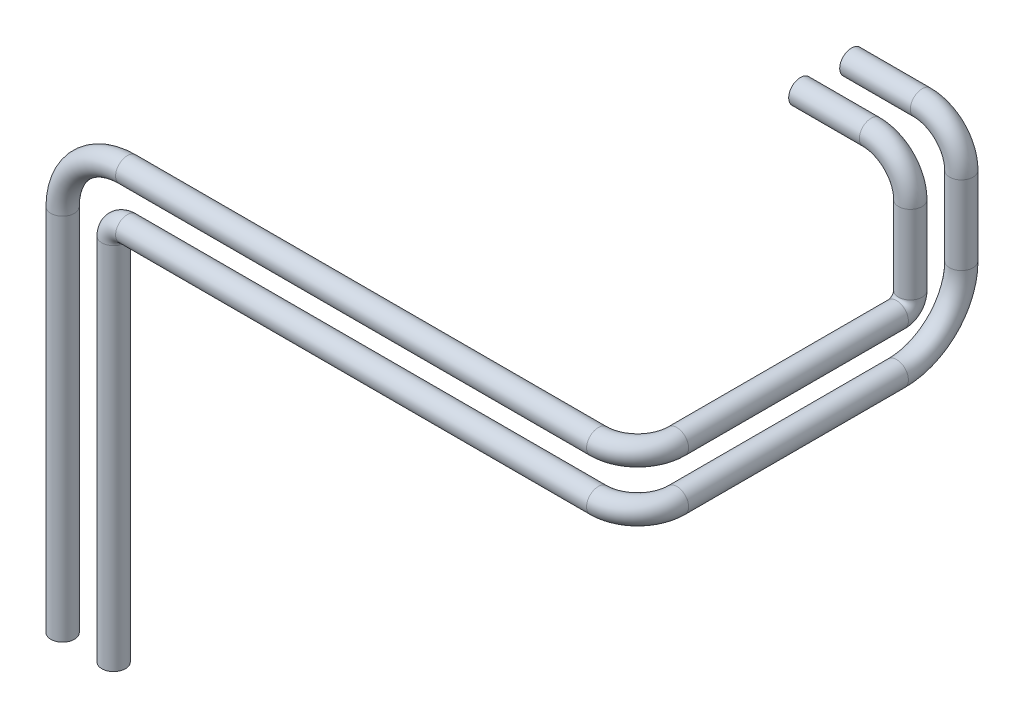
ISO-10303-21;
HEADER;
FILE_DESCRIPTION(('STEP AP214'),'2;1');
FILE_NAME('part.step','',(''),(''),'','','');
FILE_SCHEMA(('AUTOMOTIVE_DESIGN { 1 0 10303 214 1 1 1 1 }'));
ENDSEC;
DATA;
#1=APPLICATION_CONTEXT('core data for automotive mechanical design processes');
#2=APPLICATION_PROTOCOL_DEFINITION('international standard','automotive_design',2000,#1);
#3=PRODUCT_CONTEXT('',#1,'mechanical');
#4=PRODUCT('Part','Part','',(#3));
#5=PRODUCT_RELATED_PRODUCT_CATEGORY('part','',(#4));
#6=PRODUCT_DEFINITION_FORMATION('','',#4);
#7=PRODUCT_DEFINITION_CONTEXT('part definition',#1,'design');
#8=PRODUCT_DEFINITION('design','',#6,#7);
#9=PRODUCT_DEFINITION_SHAPE('','',#8);
#10=(LENGTH_UNIT() NAMED_UNIT(*) SI_UNIT(.MILLI.,.METRE.));
#11=(NAMED_UNIT(*) PLANE_ANGLE_UNIT() SI_UNIT($,.RADIAN.));
#12=(NAMED_UNIT(*) SI_UNIT($,.STERADIAN.) SOLID_ANGLE_UNIT());
#13=UNCERTAINTY_MEASURE_WITH_UNIT(LENGTH_MEASURE(1.E-05),#10,'distance_accuracy_value','');
#14=(GEOMETRIC_REPRESENTATION_CONTEXT(3) GLOBAL_UNCERTAINTY_ASSIGNED_CONTEXT((#13)) GLOBAL_UNIT_ASSIGNED_CONTEXT((#10,
#11,#12)) REPRESENTATION_CONTEXT('',''));
#15=CARTESIAN_POINT('',(0.,0.,0.));
#16=DIRECTION('',(0.,0.,1.));
#17=DIRECTION('',(1.,0.,0.));
#18=AXIS2_PLACEMENT_3D('',#15,#16,#17);
#19=CARTESIAN_POINT('',(3.25,0.,0.));
#20=DIRECTION('',(0.,1.,0.));
#21=DIRECTION('',(0.,0.,1.));
#22=AXIS2_PLACEMENT_3D('',#19,#20,#21);
#23=PLANE('',#22);
#24=CARTESIAN_POINT('',(3.25,0.,0.));
#25=DIRECTION('',(0.,1.,0.));
#26=DIRECTION('',(0.,0.,1.));
#27=AXIS2_PLACEMENT_3D('',#24,#25,#26);
#28=CIRCLE('',#27,1.5);
#29=CARTESIAN_POINT('',(3.25,0.,1.5));
#30=VERTEX_POINT('',#29);
#31=EDGE_CURVE('E57',#30,#30,#28,.T.);
#32=ORIENTED_EDGE('',*,*,#31,.F.);
#33=EDGE_LOOP('',(#32));
#34=FACE_BOUND('',#33,.T.);
#35=ADVANCED_FACE('F45',(#34),#23,.F.);
#36=CARTESIAN_POINT('',(56.,72.,-41.25));
#37=DIRECTION('',(-1.,0.,0.));
#38=DIRECTION('',(0.,1.,0.));
#39=AXIS2_PLACEMENT_3D('',#36,#37,#38);
#40=PLANE('',#39);
#41=CARTESIAN_POINT('',(56.,72.,-41.25));
#42=DIRECTION('',(-1.,0.,0.));
#43=DIRECTION('',(0.,1.,0.));
#44=AXIS2_PLACEMENT_3D('',#41,#42,#43);
#45=CIRCLE('',#44,1.5);
#46=CARTESIAN_POINT('',(56.,73.5,-41.25));
#47=VERTEX_POINT('',#46);
#48=EDGE_CURVE('E12',#47,#47,#45,.T.);
#49=ORIENTED_EDGE('',*,*,#48,.T.);
#50=EDGE_LOOP('',(#49));
#51=FACE_BOUND('',#50,.T.);
#52=ADVANCED_FACE('F60',(#51),#40,.T.);
#53=CARTESIAN_POINT('',(3.25,0.,0.));
#54=DIRECTION('',(0.,1.,0.));
#55=DIRECTION('',(0.,0.,1.));
#56=AXIS2_PLACEMENT_3D('',#53,#54,#55);
#57=CYLINDRICAL_SURFACE('',#56,1.5);
#58=CARTESIAN_POINT('',(3.25,47.,0.));
#59=DIRECTION('',(0.,1.,0.));
#60=DIRECTION('',(0.,0.,1.));
#61=AXIS2_PLACEMENT_3D('',#58,#59,#60);
#62=CIRCLE('',#61,1.5);
#63=CARTESIAN_POINT('',(1.75,47.,0.));
#64=VERTEX_POINT('',#63);
#65=EDGE_CURVE('E89',#64,#64,#62,.T.);
#66=ORIENTED_EDGE('',*,*,#65,.F.);
#67=EDGE_LOOP('',(#66));
#68=FACE_BOUND('',#67,.T.);
#69=ORIENTED_EDGE('',*,*,#31,.T.);
#70=EDGE_LOOP('',(#69));
#71=FACE_BOUND('',#70,.T.);
#72=ADVANCED_FACE('F93',(#68,#71),#57,.T.);
#73=CARTESIAN_POINT('',(5.,47.,0.));
#74=DIRECTION('',(0.,0.,-1.));
#75=DIRECTION('',(-1.,0.,0.));
#76=AXIS2_PLACEMENT_3D('',#73,#74,#75);
#77=TOROIDAL_SURFACE('',#76,1.75,1.5);
#78=CARTESIAN_POINT('',(5.,48.75,0.));
#79=DIRECTION('',(1.,0.,0.));
#80=DIRECTION('',(0.,0.,1.));
#81=AXIS2_PLACEMENT_3D('',#78,#79,#80);
#82=CIRCLE('',#81,1.5);
#83=CARTESIAN_POINT('',(5.,50.25,0.));
#84=VERTEX_POINT('',#83);
#85=EDGE_CURVE('E86',#84,#84,#82,.T.);
#86=CARTESIAN_POINT('',(5.,47.,0.));
#87=DIRECTION('',(0.,0.,-1.));
#88=DIRECTION('',(-1.,0.,0.));
#89=AXIS2_PLACEMENT_3D('',#86,#87,#88);
#90=CIRCLE('',#89,3.25);
#91=EDGE_CURVE('',#64,#84,#90,.T.);
#92=ORIENTED_EDGE('',*,*,#65,.T.);
#93=ORIENTED_EDGE('',*,*,#85,.F.);
#94=ORIENTED_EDGE('',*,*,#91,.T.);
#95=ORIENTED_EDGE('',*,*,#91,.F.);
#96=EDGE_LOOP('',(#92,#94,#93,#95));
#97=FACE_BOUND('',#96,.T.);
#98=ADVANCED_FACE('F95',(#97),#77,.T.);
#99=CARTESIAN_POINT('',(5.,48.75,0.));
#100=DIRECTION('',(1.,0.,0.));
#101=DIRECTION('',(0.,0.,-1.));
#102=AXIS2_PLACEMENT_3D('',#99,#100,#101);
#103=CYLINDRICAL_SURFACE('',#102,1.5);
#104=CARTESIAN_POINT('',(65.,48.75,0.));
#105=DIRECTION('',(1.,0.,0.));
#106=DIRECTION('',(0.,0.,1.));
#107=AXIS2_PLACEMENT_3D('',#104,#105,#106);
#108=CIRCLE('',#107,1.5);
#109=CARTESIAN_POINT('',(65.,48.75,1.5));
#110=VERTEX_POINT('',#109);
#111=EDGE_CURVE('E83',#110,#110,#108,.T.);
#112=ORIENTED_EDGE('',*,*,#111,.F.);
#113=EDGE_LOOP('',(#112));
#114=FACE_BOUND('',#113,.T.);
#115=ORIENTED_EDGE('',*,*,#85,.T.);
#116=EDGE_LOOP('',(#115));
#117=FACE_BOUND('',#116,.T.);
#118=ADVANCED_FACE('F102',(#114,#117),#103,.T.);
#119=CARTESIAN_POINT('',(65.,48.75,-5.));
#120=DIRECTION('',(0.,1.,0.));
#121=DIRECTION('',(0.,0.,1.));
#122=AXIS2_PLACEMENT_3D('',#119,#120,#121);
#123=TOROIDAL_SURFACE('',#122,5.,1.5);
#124=CARTESIAN_POINT('',(70.,48.75,-5.));
#125=DIRECTION('',(0.,0.,-1.));
#126=DIRECTION('',(1.,0.,0.));
#127=AXIS2_PLACEMENT_3D('',#124,#125,#126);
#128=CIRCLE('',#127,1.5);
#129=CARTESIAN_POINT('',(71.5,48.75,-5.));
#130=VERTEX_POINT('',#129);
#131=EDGE_CURVE('E80',#130,#130,#128,.T.);
#132=CARTESIAN_POINT('',(65.,48.75,-5.));
#133=DIRECTION('',(0.,1.,0.));
#134=DIRECTION('',(0.,0.,1.));
#135=AXIS2_PLACEMENT_3D('',#132,#133,#134);
#136=CIRCLE('',#135,6.5);
#137=EDGE_CURVE('',#110,#130,#136,.T.);
#138=ORIENTED_EDGE('',*,*,#111,.T.);
#139=ORIENTED_EDGE('',*,*,#131,.F.);
#140=ORIENTED_EDGE('',*,*,#137,.T.);
#141=ORIENTED_EDGE('',*,*,#137,.F.);
#142=EDGE_LOOP('',(#138,#140,#139,#141));
#143=FACE_BOUND('',#142,.T.);
#144=ADVANCED_FACE('F109',(#143),#123,.T.);
#145=CARTESIAN_POINT('',(70.,48.75,-5.));
#146=DIRECTION('',(0.,0.,-1.));
#147=DIRECTION('',(0.,1.,0.));
#148=AXIS2_PLACEMENT_3D('',#145,#146,#147);
#149=CYLINDRICAL_SURFACE('',#148,1.5);
#150=CARTESIAN_POINT('',(70.,48.75,-33.));
#151=DIRECTION('',(0.,0.,-1.));
#152=DIRECTION('',(1.,0.,0.));
#153=AXIS2_PLACEMENT_3D('',#150,#151,#152);
#154=CIRCLE('',#153,1.5);
#155=CARTESIAN_POINT('',(70.,47.25,-33.));
#156=VERTEX_POINT('',#155);
#157=EDGE_CURVE('E77',#156,#156,#154,.T.);
#158=ORIENTED_EDGE('',*,*,#157,.F.);
#159=EDGE_LOOP('',(#158));
#160=FACE_BOUND('',#159,.T.);
#161=ORIENTED_EDGE('',*,*,#131,.T.);
#162=EDGE_LOOP('',(#161));
#163=FACE_BOUND('',#162,.T.);
#164=ADVANCED_FACE('F113',(#160,#163),#149,.T.);
#165=CARTESIAN_POINT('',(70.,57.,-33.));
#166=DIRECTION('',(1.,0.,0.));
#167=DIRECTION('',(0.,0.,-1.));
#168=AXIS2_PLACEMENT_3D('',#165,#166,#167);
#169=TOROIDAL_SURFACE('',#168,8.25,1.5);
#170=CARTESIAN_POINT('',(70.,57.,-41.25));
#171=DIRECTION('',(0.,1.,0.));
#172=DIRECTION('',(1.,0.,0.));
#173=AXIS2_PLACEMENT_3D('',#170,#171,#172);
#174=CIRCLE('',#173,1.5);
#175=CARTESIAN_POINT('',(70.,57.,-42.75));
#176=VERTEX_POINT('',#175);
#177=EDGE_CURVE('E72',#176,#176,#174,.T.);
#178=CARTESIAN_POINT('',(70.,57.,-33.));
#179=DIRECTION('',(1.,0.,0.));
#180=DIRECTION('',(0.,0.,-1.));
#181=AXIS2_PLACEMENT_3D('',#178,#179,#180);
#182=CIRCLE('',#181,9.75);
#183=EDGE_CURVE('',#156,#176,#182,.T.);
#184=ORIENTED_EDGE('',*,*,#157,.T.);
#185=ORIENTED_EDGE('',*,*,#177,.F.);
#186=ORIENTED_EDGE('',*,*,#183,.T.);
#187=ORIENTED_EDGE('',*,*,#183,.F.);
#188=EDGE_LOOP('',(#184,#186,#185,#187));
#189=FACE_BOUND('',#188,.T.);
#190=ADVANCED_FACE('F117',(#189),#169,.T.);
#191=CARTESIAN_POINT('',(70.,57.,-41.25));
#192=DIRECTION('',(0.,1.,0.));
#193=DIRECTION('',(0.,0.,1.));
#194=AXIS2_PLACEMENT_3D('',#191,#192,#193);
#195=CYLINDRICAL_SURFACE('',#194,1.5);
#196=CARTESIAN_POINT('',(70.,67.,-41.25));
#197=DIRECTION('',(0.,1.,0.));
#198=DIRECTION('',(1.,0.,0.));
#199=AXIS2_PLACEMENT_3D('',#196,#197,#198);
#200=CIRCLE('',#199,1.5);
#201=CARTESIAN_POINT('',(71.5,67.,-41.25));
#202=VERTEX_POINT('',#201);
#203=EDGE_CURVE('E70',#202,#202,#200,.T.);
#204=ORIENTED_EDGE('',*,*,#203,.F.);
#205=EDGE_LOOP('',(#204));
#206=FACE_BOUND('',#205,.T.);
#207=ORIENTED_EDGE('',*,*,#177,.T.);
#208=EDGE_LOOP('',(#207));
#209=FACE_BOUND('',#208,.T.);
#210=ADVANCED_FACE('F121',(#206,#209),#195,.T.);
#211=CARTESIAN_POINT('',(65.,67.,-41.25));
#212=DIRECTION('',(0.,0.,1.));
#213=DIRECTION('',(1.,0.,0.));
#214=AXIS2_PLACEMENT_3D('',#211,#212,#213);
#215=TOROIDAL_SURFACE('',#214,5.,1.5);
#216=CARTESIAN_POINT('',(65.,72.,-41.25));
#217=DIRECTION('',(-1.,0.,0.));
#218=DIRECTION('',(0.,1.,0.));
#219=AXIS2_PLACEMENT_3D('',#216,#217,#218);
#220=CIRCLE('',#219,1.5);
#221=CARTESIAN_POINT('',(65.,73.5,-41.25));
#222=VERTEX_POINT('',#221);
#223=EDGE_CURVE('E52',#222,#222,#220,.T.);
#224=CARTESIAN_POINT('',(65.,67.,-41.25));
#225=DIRECTION('',(0.,0.,1.));
#226=DIRECTION('',(1.,0.,0.));
#227=AXIS2_PLACEMENT_3D('',#224,#225,#226);
#228=CIRCLE('',#227,6.50000000000001);
#229=EDGE_CURVE('',#202,#222,#228,.T.);
#230=ORIENTED_EDGE('',*,*,#203,.T.);
#231=ORIENTED_EDGE('',*,*,#223,.F.);
#232=ORIENTED_EDGE('',*,*,#229,.T.);
#233=ORIENTED_EDGE('',*,*,#229,.F.);
#234=EDGE_LOOP('',(#230,#232,#231,#233));
#235=FACE_BOUND('',#234,.T.);
#236=ADVANCED_FACE('F65',(#235),#215,.T.);
#237=CARTESIAN_POINT('',(65.,72.,-41.25));
#238=DIRECTION('',(-1.,0.,0.));
#239=DIRECTION('',(0.,0.,1.));
#240=AXIS2_PLACEMENT_3D('',#237,#238,#239);
#241=CYLINDRICAL_SURFACE('',#240,1.5);
#242=ORIENTED_EDGE('',*,*,#48,.F.);
#243=EDGE_LOOP('',(#242));
#244=FACE_BOUND('',#243,.T.);
#245=ORIENTED_EDGE('',*,*,#223,.T.);
#246=EDGE_LOOP('',(#245));
#247=FACE_BOUND('',#246,.T.);
#248=ADVANCED_FACE('F62',(#244,#247),#241,.T.);
#249=CLOSED_SHELL('',(#35,#52,#72,#98,#118,#144,#164,#190,#210,#236,#248));
#250=MANIFOLD_SOLID_BREP('B2',#249);
#251=CARTESIAN_POINT('',(-3.25,0.,0.));
#252=DIRECTION('',(0.,1.,0.));
#253=DIRECTION('',(0.,0.,1.));
#254=AXIS2_PLACEMENT_3D('',#251,#252,#253);
#255=PLANE('',#254);
#256=CARTESIAN_POINT('',(-3.25,0.,0.));
#257=DIRECTION('',(0.,1.,0.));
#258=DIRECTION('',(0.,0.,1.));
#259=AXIS2_PLACEMENT_3D('',#256,#257,#258);
#260=CIRCLE('',#259,1.5);
#261=CARTESIAN_POINT('',(-3.25,0.,1.5));
#262=VERTEX_POINT('',#261);
#263=EDGE_CURVE('E220',#262,#262,#260,.T.);
#264=ORIENTED_EDGE('',*,*,#263,.F.);
#265=EDGE_LOOP('',(#264));
#266=FACE_BOUND('',#265,.T.);
#267=ADVANCED_FACE('F208',(#266),#255,.F.);
#268=CARTESIAN_POINT('',(56.,72.,-34.75));
#269=DIRECTION('',(-1.,0.,0.));
#270=DIRECTION('',(0.,1.,0.));
#271=AXIS2_PLACEMENT_3D('',#268,#269,#270);
#272=PLANE('',#271);
#273=CARTESIAN_POINT('',(56.,72.,-34.75));
#274=DIRECTION('',(-1.,0.,0.));
#275=DIRECTION('',(0.,1.,0.));
#276=AXIS2_PLACEMENT_3D('',#273,#274,#275);
#277=CIRCLE('',#276,1.5);
#278=CARTESIAN_POINT('',(56.,73.5,-34.75));
#279=VERTEX_POINT('',#278);
#280=EDGE_CURVE('E43',#279,#279,#277,.T.);
#281=ORIENTED_EDGE('',*,*,#280,.T.);
#282=EDGE_LOOP('',(#281));
#283=FACE_BOUND('',#282,.T.);
#284=ADVANCED_FACE('F223',(#283),#272,.T.);
#285=CARTESIAN_POINT('',(-3.25,0.,0.));
#286=DIRECTION('',(0.,1.,0.));
#287=DIRECTION('',(0.,0.,1.));
#288=AXIS2_PLACEMENT_3D('',#285,#286,#287);
#289=CYLINDRICAL_SURFACE('',#288,1.5);
#290=CARTESIAN_POINT('',(-3.25,47.,0.));
#291=DIRECTION('',(0.,1.,0.));
#292=DIRECTION('',(0.,0.,1.));
#293=AXIS2_PLACEMENT_3D('',#290,#291,#292);
#294=CIRCLE('',#293,1.5);
#295=CARTESIAN_POINT('',(-4.75,47.,0.));
#296=VERTEX_POINT('',#295);
#297=EDGE_CURVE('E252',#296,#296,#294,.T.);
#298=ORIENTED_EDGE('',*,*,#297,.F.);
#299=EDGE_LOOP('',(#298));
#300=FACE_BOUND('',#299,.T.);
#301=ORIENTED_EDGE('',*,*,#263,.T.);
#302=EDGE_LOOP('',(#301));
#303=FACE_BOUND('',#302,.T.);
#304=ADVANCED_FACE('F256',(#300,#303),#289,.T.);
#305=CARTESIAN_POINT('',(5.,47.,0.));
#306=DIRECTION('',(0.,0.,-1.));
#307=DIRECTION('',(-1.,0.,0.));
#308=AXIS2_PLACEMENT_3D('',#305,#306,#307);
#309=TOROIDAL_SURFACE('',#308,8.25,1.5);
#310=CARTESIAN_POINT('',(5.,55.25,0.));
#311=DIRECTION('',(1.,0.,0.));
#312=DIRECTION('',(0.,0.,1.));
#313=AXIS2_PLACEMENT_3D('',#310,#311,#312);
#314=CIRCLE('',#313,1.5);
#315=CARTESIAN_POINT('',(5.,56.75,0.));
#316=VERTEX_POINT('',#315);
#317=EDGE_CURVE('E249',#316,#316,#314,.T.);
#318=CARTESIAN_POINT('',(5.,47.,0.));
#319=DIRECTION('',(0.,0.,-1.));
#320=DIRECTION('',(-1.,0.,0.));
#321=AXIS2_PLACEMENT_3D('',#318,#319,#320);
#322=CIRCLE('',#321,9.75);
#323=EDGE_CURVE('',#296,#316,#322,.T.);
#324=ORIENTED_EDGE('',*,*,#297,.T.);
#325=ORIENTED_EDGE('',*,*,#317,.F.);
#326=ORIENTED_EDGE('',*,*,#323,.T.);
#327=ORIENTED_EDGE('',*,*,#323,.F.);
#328=EDGE_LOOP('',(#324,#326,#325,#327));
#329=FACE_BOUND('',#328,.T.);
#330=ADVANCED_FACE('F258',(#329),#309,.T.);
#331=CARTESIAN_POINT('',(5.,55.25,0.));
#332=DIRECTION('',(1.,0.,0.));
#333=DIRECTION('',(0.,0.,-1.));
#334=AXIS2_PLACEMENT_3D('',#331,#332,#333);
#335=CYLINDRICAL_SURFACE('',#334,1.5);
#336=CARTESIAN_POINT('',(65.,55.25,0.));
#337=DIRECTION('',(1.,0.,0.));
#338=DIRECTION('',(0.,0.,1.));
#339=AXIS2_PLACEMENT_3D('',#336,#337,#338);
#340=CIRCLE('',#339,1.5);
#341=CARTESIAN_POINT('',(65.,55.25,1.5));
#342=VERTEX_POINT('',#341);
#343=EDGE_CURVE('E246',#342,#342,#340,.T.);
#344=ORIENTED_EDGE('',*,*,#343,.F.);
#345=EDGE_LOOP('',(#344));
#346=FACE_BOUND('',#345,.T.);
#347=ORIENTED_EDGE('',*,*,#317,.T.);
#348=EDGE_LOOP('',(#347));
#349=FACE_BOUND('',#348,.T.);
#350=ADVANCED_FACE('F265',(#346,#349),#335,.T.);
#351=CARTESIAN_POINT('',(65.,55.25,-5.));
#352=DIRECTION('',(0.,1.,0.));
#353=DIRECTION('',(0.,0.,1.));
#354=AXIS2_PLACEMENT_3D('',#351,#352,#353);
#355=TOROIDAL_SURFACE('',#354,5.,1.5);
#356=CARTESIAN_POINT('',(70.,55.25,-5.));
#357=DIRECTION('',(0.,0.,-1.));
#358=DIRECTION('',(1.,0.,0.));
#359=AXIS2_PLACEMENT_3D('',#356,#357,#358);
#360=CIRCLE('',#359,1.5);
#361=CARTESIAN_POINT('',(71.5,55.25,-5.));
#362=VERTEX_POINT('',#361);
#363=EDGE_CURVE('E243',#362,#362,#360,.T.);
#364=CARTESIAN_POINT('',(65.,55.25,-5.));
#365=DIRECTION('',(0.,1.,0.));
#366=DIRECTION('',(0.,0.,1.));
#367=AXIS2_PLACEMENT_3D('',#364,#365,#366);
#368=CIRCLE('',#367,6.50000000000001);
#369=EDGE_CURVE('',#342,#362,#368,.T.);
#370=ORIENTED_EDGE('',*,*,#343,.T.);
#371=ORIENTED_EDGE('',*,*,#363,.F.);
#372=ORIENTED_EDGE('',*,*,#369,.T.);
#373=ORIENTED_EDGE('',*,*,#369,.F.);
#374=EDGE_LOOP('',(#370,#372,#371,#373));
#375=FACE_BOUND('',#374,.T.);
#376=ADVANCED_FACE('F272',(#375),#355,.T.);
#377=CARTESIAN_POINT('',(70.,55.25,-5.));
#378=DIRECTION('',(0.,0.,-1.));
#379=DIRECTION('',(0.,1.,0.));
#380=AXIS2_PLACEMENT_3D('',#377,#378,#379);
#381=CYLINDRICAL_SURFACE('',#380,1.5);
#382=CARTESIAN_POINT('',(70.,55.25,-33.));
#383=DIRECTION('',(0.,0.,-1.));
#384=DIRECTION('',(1.,0.,0.));
#385=AXIS2_PLACEMENT_3D('',#382,#383,#384);
#386=CIRCLE('',#385,1.5);
#387=CARTESIAN_POINT('',(70.,53.75,-33.));
#388=VERTEX_POINT('',#387);
#389=EDGE_CURVE('E240',#388,#388,#386,.T.);
#390=ORIENTED_EDGE('',*,*,#389,.F.);
#391=EDGE_LOOP('',(#390));
#392=FACE_BOUND('',#391,.T.);
#393=ORIENTED_EDGE('',*,*,#363,.T.);
#394=EDGE_LOOP('',(#393));
#395=FACE_BOUND('',#394,.T.);
#396=ADVANCED_FACE('F276',(#392,#395),#381,.T.);
#397=CARTESIAN_POINT('',(70.,57.,-33.));
#398=DIRECTION('',(1.,0.,0.));
#399=DIRECTION('',(0.,0.,-1.));
#400=AXIS2_PLACEMENT_3D('',#397,#398,#399);
#401=TOROIDAL_SURFACE('',#400,1.74999999999999,1.5);
#402=CARTESIAN_POINT('',(70.,57.,-34.75));
#403=DIRECTION('',(0.,1.,0.));
#404=DIRECTION('',(1.,0.,0.));
#405=AXIS2_PLACEMENT_3D('',#402,#403,#404);
#406=CIRCLE('',#405,1.5);
#407=CARTESIAN_POINT('',(70.,57.,-36.25));
#408=VERTEX_POINT('',#407);
#409=EDGE_CURVE('E235',#408,#408,#406,.T.);
#410=CARTESIAN_POINT('',(70.,57.,-33.));
#411=DIRECTION('',(1.,0.,0.));
#412=DIRECTION('',(0.,0.,-1.));
#413=AXIS2_PLACEMENT_3D('',#410,#411,#412);
#414=CIRCLE('',#413,3.25);
#415=EDGE_CURVE('',#388,#408,#414,.T.);
#416=ORIENTED_EDGE('',*,*,#389,.T.);
#417=ORIENTED_EDGE('',*,*,#409,.F.);
#418=ORIENTED_EDGE('',*,*,#415,.T.);
#419=ORIENTED_EDGE('',*,*,#415,.F.);
#420=EDGE_LOOP('',(#416,#418,#417,#419));
#421=FACE_BOUND('',#420,.T.);
#422=ADVANCED_FACE('F280',(#421),#401,.T.);
#423=CARTESIAN_POINT('',(70.,57.,-34.75));
#424=DIRECTION('',(0.,1.,0.));
#425=DIRECTION('',(0.,0.,1.));
#426=AXIS2_PLACEMENT_3D('',#423,#424,#425);
#427=CYLINDRICAL_SURFACE('',#426,1.5);
#428=CARTESIAN_POINT('',(70.,67.,-34.75));
#429=DIRECTION('',(0.,1.,0.));
#430=DIRECTION('',(1.,0.,0.));
#431=AXIS2_PLACEMENT_3D('',#428,#429,#430);
#432=CIRCLE('',#431,1.5);
#433=CARTESIAN_POINT('',(71.5,67.,-34.75));
#434=VERTEX_POINT('',#433);
#435=EDGE_CURVE('E233',#434,#434,#432,.T.);
#436=ORIENTED_EDGE('',*,*,#435,.F.);
#437=EDGE_LOOP('',(#436));
#438=FACE_BOUND('',#437,.T.);
#439=ORIENTED_EDGE('',*,*,#409,.T.);
#440=EDGE_LOOP('',(#439));
#441=FACE_BOUND('',#440,.T.);
#442=ADVANCED_FACE('F284',(#438,#441),#427,.T.);
#443=CARTESIAN_POINT('',(65.,67.,-34.75));
#444=DIRECTION('',(0.,0.,1.));
#445=DIRECTION('',(1.,0.,0.));
#446=AXIS2_PLACEMENT_3D('',#443,#444,#445);
#447=TOROIDAL_SURFACE('',#446,5.,1.5);
#448=CARTESIAN_POINT('',(65.,72.,-34.75));
#449=DIRECTION('',(-1.,0.,0.));
#450=DIRECTION('',(0.,1.,0.));
#451=AXIS2_PLACEMENT_3D('',#448,#449,#450);
#452=CIRCLE('',#451,1.5);
#453=CARTESIAN_POINT('',(65.,73.5,-34.75));
#454=VERTEX_POINT('',#453);
#455=EDGE_CURVE('E215',#454,#454,#452,.T.);
#456=CARTESIAN_POINT('',(65.,67.,-34.75));
#457=DIRECTION('',(0.,0.,1.));
#458=DIRECTION('',(1.,0.,0.));
#459=AXIS2_PLACEMENT_3D('',#456,#457,#458);
#460=CIRCLE('',#459,6.50000000000001);
#461=EDGE_CURVE('',#434,#454,#460,.T.);
#462=ORIENTED_EDGE('',*,*,#435,.T.);
#463=ORIENTED_EDGE('',*,*,#455,.F.);
#464=ORIENTED_EDGE('',*,*,#461,.T.);
#465=ORIENTED_EDGE('',*,*,#461,.F.);
#466=EDGE_LOOP('',(#462,#464,#463,#465));
#467=FACE_BOUND('',#466,.T.);
#468=ADVANCED_FACE('F228',(#467),#447,.T.);
#469=CARTESIAN_POINT('',(65.,72.,-34.75));
#470=DIRECTION('',(-1.,0.,0.));
#471=DIRECTION('',(0.,0.,1.));
#472=AXIS2_PLACEMENT_3D('',#469,#470,#471);
#473=CYLINDRICAL_SURFACE('',#472,1.5);
#474=ORIENTED_EDGE('',*,*,#280,.F.);
#475=EDGE_LOOP('',(#474));
#476=FACE_BOUND('',#475,.T.);
#477=ORIENTED_EDGE('',*,*,#455,.T.);
#478=EDGE_LOOP('',(#477));
#479=FACE_BOUND('',#478,.T.);
#480=ADVANCED_FACE('F225',(#476,#479),#473,.T.);
#481=CLOSED_SHELL('',(#267,#284,#304,#330,#350,#376,#396,#422,#442,#468,#480));
#482=MANIFOLD_SOLID_BREP('B6',#481);
#483=ADVANCED_BREP_SHAPE_REPRESENTATION('',(#18,#250,#482),#14);
#484=SHAPE_DEFINITION_REPRESENTATION(#9,#483);
ENDSEC;
END-ISO-10303-21;
